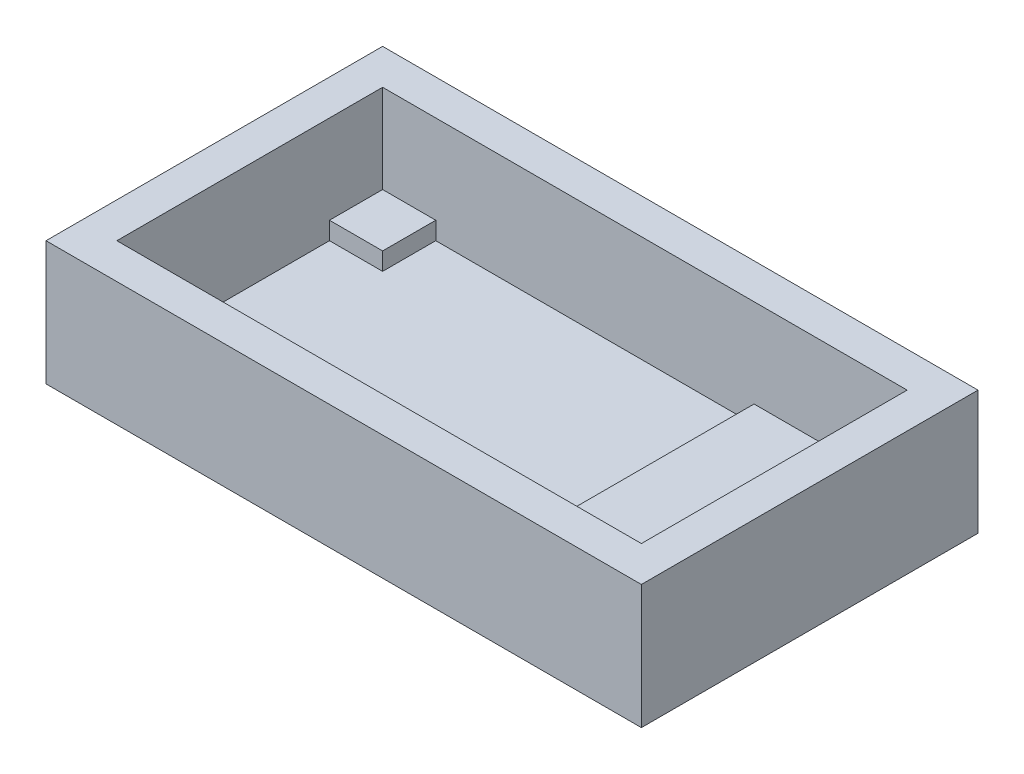
ISO-10303-21;
HEADER;
FILE_DESCRIPTION(('STEP AP214'),'2;1');
FILE_NAME('part.step','',(''),(''),'','','');
FILE_SCHEMA(('AUTOMOTIVE_DESIGN { 1 0 10303 214 1 1 1 1 }'));
ENDSEC;
DATA;
#1=APPLICATION_CONTEXT('core data for automotive mechanical design processes');
#2=APPLICATION_PROTOCOL_DEFINITION('international standard','automotive_design',2000,#1);
#3=PRODUCT_CONTEXT('',#1,'mechanical');
#4=PRODUCT('Part','Part','',(#3));
#5=PRODUCT_RELATED_PRODUCT_CATEGORY('part','',(#4));
#6=PRODUCT_DEFINITION_FORMATION('','',#4);
#7=PRODUCT_DEFINITION_CONTEXT('part definition',#1,'design');
#8=PRODUCT_DEFINITION('design','',#6,#7);
#9=PRODUCT_DEFINITION_SHAPE('','',#8);
#10=(LENGTH_UNIT() NAMED_UNIT(*) SI_UNIT(.MILLI.,.METRE.));
#11=(NAMED_UNIT(*) PLANE_ANGLE_UNIT() SI_UNIT($,.RADIAN.));
#12=(NAMED_UNIT(*) SI_UNIT($,.STERADIAN.) SOLID_ANGLE_UNIT());
#13=UNCERTAINTY_MEASURE_WITH_UNIT(LENGTH_MEASURE(1.E-05),#10,'distance_accuracy_value','');
#14=(GEOMETRIC_REPRESENTATION_CONTEXT(3) GLOBAL_UNCERTAINTY_ASSIGNED_CONTEXT((#13)) GLOBAL_UNIT_ASSIGNED_CONTEXT((#10,
#11,#12)) REPRESENTATION_CONTEXT('',''));
#15=CARTESIAN_POINT('',(0.,0.,0.));
#16=DIRECTION('',(0.,0.,1.));
#17=DIRECTION('',(1.,0.,0.));
#18=AXIS2_PLACEMENT_3D('',#15,#16,#17);
#19=CARTESIAN_POINT('',(0.,5.,0.));
#20=DIRECTION('',(0.,-1.,0.));
#21=DIRECTION('',(0.,0.,-1.));
#22=AXIS2_PLACEMENT_3D('',#19,#20,#21);
#23=PLANE('',#22);
#24=DIRECTION('',(0.,0.,1.));
#25=VECTOR('',#24,1.);
#26=CARTESIAN_POINT('',(114.837692593404,5.,-85.0103773584906));
#27=LINE('',#26,#25);
#28=CARTESIAN_POINT('',(114.837692593404,5.,-85.0103773584906));
#29=VERTEX_POINT('',#28);
#30=CARTESIAN_POINT('',(114.837692593404,5.,-10.));
#31=VERTEX_POINT('',#30);
#32=EDGE_CURVE('E183',#29,#31,#27,.T.);
#33=ORIENTED_EDGE('',*,*,#32,.F.);
#34=DIRECTION('',(-1.,0.,0.));
#35=VECTOR('',#34,1.);
#36=CARTESIAN_POINT('',(10.,5.,-85.0103773584906));
#37=LINE('',#36,#35);
#38=CARTESIAN_POINT('',(25.,5.,-85.0103773584906));
#39=VERTEX_POINT('',#38);
#40=EDGE_CURVE('E234',#29,#39,#37,.T.);
#41=ORIENTED_EDGE('',*,*,#40,.T.);
#42=DIRECTION('',(0.,0.,-1.));
#43=VECTOR('',#42,1.);
#44=CARTESIAN_POINT('',(25.,5.,-85.0103773584906));
#45=LINE('',#44,#43);
#46=CARTESIAN_POINT('',(25.,5.,-70.0103773584906));
#47=VERTEX_POINT('',#46);
#48=EDGE_CURVE('E209',#47,#39,#45,.T.);
#49=ORIENTED_EDGE('',*,*,#48,.F.);
#50=DIRECTION('',(1.,0.,0.));
#51=VECTOR('',#50,1.);
#52=CARTESIAN_POINT('',(10.,5.,-70.0103773584906));
#53=LINE('',#52,#51);
#54=CARTESIAN_POINT('',(10.,5.,-70.0103773584906));
#55=VERTEX_POINT('',#54);
#56=EDGE_CURVE('E198',#55,#47,#53,.T.);
#57=ORIENTED_EDGE('',*,*,#56,.F.);
#58=DIRECTION('',(0.,0.,1.));
#59=VECTOR('',#58,1.);
#60=CARTESIAN_POINT('',(10.,5.,-10.));
#61=LINE('',#60,#59);
#62=CARTESIAN_POINT('',(10.,5.,-25.));
#63=VERTEX_POINT('',#62);
#64=EDGE_CURVE('E230',#55,#63,#61,.T.);
#65=ORIENTED_EDGE('',*,*,#64,.T.);
#66=DIRECTION('',(-1.,0.,0.));
#67=VECTOR('',#66,1.);
#68=CARTESIAN_POINT('',(10.,5.,-25.));
#69=LINE('',#68,#67);
#70=CARTESIAN_POINT('',(25.,5.,-25.));
#71=VERTEX_POINT('',#70);
#72=EDGE_CURVE('E193',#71,#63,#69,.T.);
#73=ORIENTED_EDGE('',*,*,#72,.F.);
#74=DIRECTION('',(0.,0.,-1.));
#75=VECTOR('',#74,1.);
#76=CARTESIAN_POINT('',(25.,5.,-10.));
#77=LINE('',#76,#75);
#78=CARTESIAN_POINT('',(25.,5.,-10.));
#79=VERTEX_POINT('',#78);
#80=EDGE_CURVE('E195',#79,#71,#77,.T.);
#81=ORIENTED_EDGE('',*,*,#80,.F.);
#82=DIRECTION('',(1.,0.,0.));
#83=VECTOR('',#82,1.);
#84=CARTESIAN_POINT('',(10.,5.,-10.));
#85=LINE('',#84,#83);
#86=EDGE_CURVE('E241',#79,#31,#85,.T.);
#87=ORIENTED_EDGE('',*,*,#86,.T.);
#88=EDGE_LOOP('',(#33,#41,#49,#57,#65,#73,#81,#87));
#89=FACE_BOUND('',#88,.T.);
#90=ADVANCED_FACE('F41',(#89),#23,.F.);
#91=CARTESIAN_POINT('',(10.,35.,-10.));
#92=DIRECTION('',(0.,0.,-1.));
#93=DIRECTION('',(-1.,0.,0.));
#94=AXIS2_PLACEMENT_3D('',#91,#92,#93);
#95=PLANE('',#94);
#96=DIRECTION('',(1.,0.,0.));
#97=VECTOR('',#96,1.);
#98=CARTESIAN_POINT('',(114.837692593404,10.,-10.));
#99=LINE('',#98,#97);
#100=CARTESIAN_POINT('',(114.837692593404,10.,-10.));
#101=VERTEX_POINT('',#100);
#102=CARTESIAN_POINT('',(158.045783506068,10.,-10.));
#103=VERTEX_POINT('',#102);
#104=EDGE_CURVE('E56',#101,#103,#99,.T.);
#105=ORIENTED_EDGE('',*,*,#104,.F.);
#106=DIRECTION('',(0.,-1.,0.));
#107=VECTOR('',#106,1.);
#108=CARTESIAN_POINT('',(114.837692593404,10.,-10.));
#109=LINE('',#108,#107);
#110=EDGE_CURVE('E61',#101,#31,#109,.T.);
#111=ORIENTED_EDGE('',*,*,#110,.T.);
#112=ORIENTED_EDGE('',*,*,#86,.F.);
#113=DIRECTION('',(0.,-1.,0.));
#114=VECTOR('',#113,1.);
#115=CARTESIAN_POINT('',(25.,10.,-10.));
#116=LINE('',#115,#114);
#117=CARTESIAN_POINT('',(25.,10.,-10.));
#118=VERTEX_POINT('',#117);
#119=EDGE_CURVE('E184',#118,#79,#116,.T.);
#120=ORIENTED_EDGE('',*,*,#119,.F.);
#121=DIRECTION('',(1.,0.,0.));
#122=VECTOR('',#121,1.);
#123=CARTESIAN_POINT('',(10.,10.,-10.));
#124=LINE('',#123,#122);
#125=CARTESIAN_POINT('',(10.,10.,-10.));
#126=VERTEX_POINT('',#125);
#127=EDGE_CURVE('E202',#126,#118,#124,.T.);
#128=ORIENTED_EDGE('',*,*,#127,.F.);
#129=DIRECTION('',(0.,-1.,0.));
#130=VECTOR('',#129,1.);
#131=CARTESIAN_POINT('',(10.,35.,-10.));
#132=LINE('',#131,#130);
#133=CARTESIAN_POINT('',(10.,35.,-10.));
#134=VERTEX_POINT('',#133);
#135=EDGE_CURVE('E247',#134,#126,#132,.T.);
#136=ORIENTED_EDGE('',*,*,#135,.F.);
#137=DIRECTION('',(1.,0.,0.));
#138=VECTOR('',#137,1.);
#139=CARTESIAN_POINT('',(10.,35.,-10.));
#140=LINE('',#139,#138);
#141=CARTESIAN_POINT('',(158.045783506068,35.,-10.));
#142=VERTEX_POINT('',#141);
#143=EDGE_CURVE('E233',#134,#142,#140,.T.);
#144=ORIENTED_EDGE('',*,*,#143,.T.);
#145=DIRECTION('',(0.,-1.,0.));
#146=VECTOR('',#145,1.);
#147=CARTESIAN_POINT('',(158.045783506068,35.,-10.));
#148=LINE('',#147,#146);
#149=EDGE_CURVE('E164',#142,#103,#148,.T.);
#150=ORIENTED_EDGE('',*,*,#149,.T.);
#151=EDGE_LOOP('',(#105,#111,#112,#120,#128,#136,#144,#150));
#152=FACE_BOUND('',#151,.T.);
#153=ADVANCED_FACE('F304',(#152),#95,.T.);
#154=CARTESIAN_POINT('',(10.,35.,-85.0103773584906));
#155=DIRECTION('',(0.,0.,1.));
#156=DIRECTION('',(1.,0.,0.));
#157=AXIS2_PLACEMENT_3D('',#154,#155,#156);
#158=PLANE('',#157);
#159=ORIENTED_EDGE('',*,*,#40,.F.);
#160=DIRECTION('',(0.,-1.,0.));
#161=VECTOR('',#160,1.);
#162=CARTESIAN_POINT('',(114.837692593404,10.,-85.0103773584906));
#163=LINE('',#162,#161);
#164=CARTESIAN_POINT('',(114.837692593404,10.,-85.0103773584906));
#165=VERTEX_POINT('',#164);
#166=EDGE_CURVE('E172',#165,#29,#163,.T.);
#167=ORIENTED_EDGE('',*,*,#166,.F.);
#168=DIRECTION('',(-1.,0.,0.));
#169=VECTOR('',#168,1.);
#170=CARTESIAN_POINT('',(114.837692593404,10.,-85.0103773584906));
#171=LINE('',#170,#169);
#172=CARTESIAN_POINT('',(158.045783506068,10.,-85.0103773584906));
#173=VERTEX_POINT('',#172);
#174=EDGE_CURVE('E168',#173,#165,#171,.T.);
#175=ORIENTED_EDGE('',*,*,#174,.F.);
#176=DIRECTION('',(0.,-1.,0.));
#177=VECTOR('',#176,1.);
#178=CARTESIAN_POINT('',(158.045783506068,35.,-85.0103773584906));
#179=LINE('',#178,#177);
#180=CARTESIAN_POINT('',(158.045783506068,35.,-85.0103773584906));
#181=VERTEX_POINT('',#180);
#182=EDGE_CURVE('E154',#181,#173,#179,.T.);
#183=ORIENTED_EDGE('',*,*,#182,.F.);
#184=DIRECTION('',(-1.,0.,0.));
#185=VECTOR('',#184,1.);
#186=CARTESIAN_POINT('',(10.,35.,-85.0103773584906));
#187=LINE('',#186,#185);
#188=CARTESIAN_POINT('',(10.,35.,-85.0103773584906));
#189=VERTEX_POINT('',#188);
#190=EDGE_CURVE('E237',#181,#189,#187,.T.);
#191=ORIENTED_EDGE('',*,*,#190,.T.);
#192=DIRECTION('',(0.,-1.,0.));
#193=VECTOR('',#192,1.);
#194=CARTESIAN_POINT('',(10.,35.,-85.0103773584906));
#195=LINE('',#194,#193);
#196=CARTESIAN_POINT('',(10.,10.,-85.0103773584906));
#197=VERTEX_POINT('',#196);
#198=EDGE_CURVE('E165',#189,#197,#195,.T.);
#199=ORIENTED_EDGE('',*,*,#198,.T.);
#200=DIRECTION('',(-1.,0.,0.));
#201=VECTOR('',#200,1.);
#202=CARTESIAN_POINT('',(10.,10.,-85.0103773584906));
#203=LINE('',#202,#201);
#204=CARTESIAN_POINT('',(25.,10.,-85.0103773584906));
#205=VERTEX_POINT('',#204);
#206=EDGE_CURVE('E214',#205,#197,#203,.T.);
#207=ORIENTED_EDGE('',*,*,#206,.F.);
#208=DIRECTION('',(0.,-1.,0.));
#209=VECTOR('',#208,1.);
#210=CARTESIAN_POINT('',(25.,10.,-85.0103773584906));
#211=LINE('',#210,#209);
#212=EDGE_CURVE('E217',#205,#39,#211,.T.);
#213=ORIENTED_EDGE('',*,*,#212,.T.);
#214=EDGE_LOOP('',(#159,#167,#175,#183,#191,#199,#207,#213));
#215=FACE_BOUND('',#214,.T.);
#216=ADVANCED_FACE('F170',(#215),#158,.T.);
#217=CARTESIAN_POINT('',(10.,35.,-10.));
#218=DIRECTION('',(1.,0.,0.));
#219=DIRECTION('',(0.,0.,-1.));
#220=AXIS2_PLACEMENT_3D('',#217,#218,#219);
#221=PLANE('',#220);
#222=DIRECTION('',(0.,0.,1.));
#223=VECTOR('',#222,1.);
#224=CARTESIAN_POINT('',(10.,10.,-10.));
#225=LINE('',#224,#223);
#226=CARTESIAN_POINT('',(10.,10.,-25.));
#227=VERTEX_POINT('',#226);
#228=EDGE_CURVE('E196',#227,#126,#225,.T.);
#229=ORIENTED_EDGE('',*,*,#228,.F.);
#230=DIRECTION('',(0.,-1.,0.));
#231=VECTOR('',#230,1.);
#232=CARTESIAN_POINT('',(10.,10.,-25.));
#233=LINE('',#232,#231);
#234=EDGE_CURVE('E189',#227,#63,#233,.T.);
#235=ORIENTED_EDGE('',*,*,#234,.T.);
#236=ORIENTED_EDGE('',*,*,#64,.F.);
#237=DIRECTION('',(0.,-1.,0.));
#238=VECTOR('',#237,1.);
#239=CARTESIAN_POINT('',(10.,10.,-70.0103773584906));
#240=LINE('',#239,#238);
#241=CARTESIAN_POINT('',(10.,10.,-70.0103773584906));
#242=VERTEX_POINT('',#241);
#243=EDGE_CURVE('E227',#242,#55,#240,.T.);
#244=ORIENTED_EDGE('',*,*,#243,.F.);
#245=DIRECTION('',(0.,0.,1.));
#246=VECTOR('',#245,1.);
#247=CARTESIAN_POINT('',(10.,10.,-85.0103773584906));
#248=LINE('',#247,#246);
#249=EDGE_CURVE('E205',#197,#242,#248,.T.);
#250=ORIENTED_EDGE('',*,*,#249,.F.);
#251=ORIENTED_EDGE('',*,*,#198,.F.);
#252=DIRECTION('',(0.,0.,1.));
#253=VECTOR('',#252,1.);
#254=CARTESIAN_POINT('',(10.,35.,-10.));
#255=LINE('',#254,#253);
#256=EDGE_CURVE('E231',#189,#134,#255,.T.);
#257=ORIENTED_EDGE('',*,*,#256,.T.);
#258=ORIENTED_EDGE('',*,*,#135,.T.);
#259=EDGE_LOOP('',(#229,#235,#236,#244,#250,#251,#257,#258));
#260=FACE_BOUND('',#259,.T.);
#261=ADVANCED_FACE('F302',(#260),#221,.T.);
#262=CARTESIAN_POINT('',(0.,5.,0.));
#263=DIRECTION('',(1.,0.,0.));
#264=DIRECTION('',(0.,0.,-1.));
#265=AXIS2_PLACEMENT_3D('',#262,#263,#264);
#266=PLANE('',#265);
#267=DIRECTION('',(0.,0.,1.));
#268=VECTOR('',#267,1.);
#269=CARTESIAN_POINT('',(0.,0.,0.));
#270=LINE('',#269,#268);
#271=CARTESIAN_POINT('',(0.,0.,-95.0103773584906));
#272=VERTEX_POINT('',#271);
#273=CARTESIAN_POINT('',(0.,0.,0.));
#274=VERTEX_POINT('',#273);
#275=EDGE_CURVE('E262',#272,#274,#270,.T.);
#276=ORIENTED_EDGE('',*,*,#275,.T.);
#277=DIRECTION('',(0.,-1.,0.));
#278=VECTOR('',#277,1.);
#279=CARTESIAN_POINT('',(0.,5.,0.));
#280=LINE('',#279,#278);
#281=CARTESIAN_POINT('',(0.,35.,0.));
#282=VERTEX_POINT('',#281);
#283=EDGE_CURVE('E11',#282,#274,#280,.T.);
#284=ORIENTED_EDGE('',*,*,#283,.F.);
#285=DIRECTION('',(0.,0.,1.));
#286=VECTOR('',#285,1.);
#287=CARTESIAN_POINT('',(0.,35.,-95.0103773584906));
#288=LINE('',#287,#286);
#289=CARTESIAN_POINT('',(0.,35.,-95.0103773584906));
#290=VERTEX_POINT('',#289);
#291=EDGE_CURVE('E253',#290,#282,#288,.T.);
#292=ORIENTED_EDGE('',*,*,#291,.F.);
#293=DIRECTION('',(0.,-1.,0.));
#294=VECTOR('',#293,1.);
#295=CARTESIAN_POINT('',(0.,5.,-95.0103773584906));
#296=LINE('',#295,#294);
#297=EDGE_CURVE('E271',#290,#272,#296,.T.);
#298=ORIENTED_EDGE('',*,*,#297,.T.);
#299=EDGE_LOOP('',(#276,#284,#292,#298));
#300=FACE_BOUND('',#299,.T.);
#301=ADVANCED_FACE('F43',(#300),#266,.F.);
#302=CARTESIAN_POINT('',(0.,5.,0.));
#303=DIRECTION('',(0.,0.,-1.));
#304=DIRECTION('',(-1.,0.,0.));
#305=AXIS2_PLACEMENT_3D('',#302,#303,#304);
#306=PLANE('',#305);
#307=DIRECTION('',(1.,0.,0.));
#308=VECTOR('',#307,1.);
#309=CARTESIAN_POINT('',(0.,0.,0.));
#310=LINE('',#309,#308);
#311=CARTESIAN_POINT('',(168.045783506068,0.,0.));
#312=VERTEX_POINT('',#311);
#313=EDGE_CURVE('E265',#274,#312,#310,.T.);
#314=ORIENTED_EDGE('',*,*,#313,.T.);
#315=DIRECTION('',(0.,-1.,0.));
#316=VECTOR('',#315,1.);
#317=CARTESIAN_POINT('',(168.045783506068,5.,0.));
#318=LINE('',#317,#316);
#319=CARTESIAN_POINT('',(168.045783506068,35.,0.));
#320=VERTEX_POINT('',#319);
#321=EDGE_CURVE('E49',#320,#312,#318,.T.);
#322=ORIENTED_EDGE('',*,*,#321,.F.);
#323=DIRECTION('',(1.,0.,0.));
#324=VECTOR('',#323,1.);
#325=CARTESIAN_POINT('',(0.,35.,0.));
#326=LINE('',#325,#324);
#327=EDGE_CURVE('E256',#282,#320,#326,.T.);
#328=ORIENTED_EDGE('',*,*,#327,.F.);
#329=ORIENTED_EDGE('',*,*,#283,.T.);
#330=EDGE_LOOP('',(#314,#322,#328,#329));
#331=FACE_BOUND('',#330,.T.);
#332=ADVANCED_FACE('F295',(#331),#306,.F.);
#333=CARTESIAN_POINT('',(168.045783506068,5.,0.));
#334=DIRECTION('',(-1.,0.,0.));
#335=DIRECTION('',(0.,0.,1.));
#336=AXIS2_PLACEMENT_3D('',#333,#334,#335);
#337=PLANE('',#336);
#338=DIRECTION('',(0.,0.,-1.));
#339=VECTOR('',#338,1.);
#340=CARTESIAN_POINT('',(168.045783506068,0.,0.));
#341=LINE('',#340,#339);
#342=CARTESIAN_POINT('',(168.045783506068,0.,-95.0103773584906));
#343=VERTEX_POINT('',#342);
#344=EDGE_CURVE('E267',#312,#343,#341,.T.);
#345=ORIENTED_EDGE('',*,*,#344,.T.);
#346=DIRECTION('',(0.,-1.,0.));
#347=VECTOR('',#346,1.);
#348=CARTESIAN_POINT('',(168.045783506068,5.,-95.0103773584906));
#349=LINE('',#348,#347);
#350=CARTESIAN_POINT('',(168.045783506068,35.,-95.0103773584906));
#351=VERTEX_POINT('',#350);
#352=EDGE_CURVE('E274',#351,#343,#349,.T.);
#353=ORIENTED_EDGE('',*,*,#352,.F.);
#354=DIRECTION('',(0.,0.,-1.));
#355=VECTOR('',#354,1.);
#356=CARTESIAN_POINT('',(168.045783506068,35.,0.));
#357=LINE('',#356,#355);
#358=EDGE_CURVE('E259',#320,#351,#357,.T.);
#359=ORIENTED_EDGE('',*,*,#358,.F.);
#360=ORIENTED_EDGE('',*,*,#321,.T.);
#361=EDGE_LOOP('',(#345,#353,#359,#360));
#362=FACE_BOUND('',#361,.T.);
#363=ADVANCED_FACE('F280',(#362),#337,.F.);
#364=CARTESIAN_POINT('',(0.,5.,-95.0103773584906));
#365=DIRECTION('',(0.,0.,1.));
#366=DIRECTION('',(1.,0.,0.));
#367=AXIS2_PLACEMENT_3D('',#364,#365,#366);
#368=PLANE('',#367);
#369=DIRECTION('',(-1.,0.,0.));
#370=VECTOR('',#369,1.);
#371=CARTESIAN_POINT('',(0.,0.,-95.0103773584906));
#372=LINE('',#371,#370);
#373=EDGE_CURVE('E269',#343,#272,#372,.T.);
#374=ORIENTED_EDGE('',*,*,#373,.T.);
#375=ORIENTED_EDGE('',*,*,#297,.F.);
#376=DIRECTION('',(-1.,0.,0.));
#377=VECTOR('',#376,1.);
#378=CARTESIAN_POINT('',(168.045783506068,35.,-95.0103773584906));
#379=LINE('',#378,#377);
#380=EDGE_CURVE('E250',#351,#290,#379,.T.);
#381=ORIENTED_EDGE('',*,*,#380,.F.);
#382=ORIENTED_EDGE('',*,*,#352,.T.);
#383=EDGE_LOOP('',(#374,#375,#381,#382));
#384=FACE_BOUND('',#383,.T.);
#385=ADVANCED_FACE('F288',(#384),#368,.F.);
#386=CARTESIAN_POINT('',(0.,0.,0.));
#387=DIRECTION('',(0.,-1.,0.));
#388=DIRECTION('',(0.,0.,-1.));
#389=AXIS2_PLACEMENT_3D('',#386,#387,#388);
#390=PLANE('',#389);
#391=ORIENTED_EDGE('',*,*,#275,.F.);
#392=ORIENTED_EDGE('',*,*,#373,.F.);
#393=ORIENTED_EDGE('',*,*,#344,.F.);
#394=ORIENTED_EDGE('',*,*,#313,.F.);
#395=EDGE_LOOP('',(#391,#392,#393,#394));
#396=FACE_BOUND('',#395,.T.);
#397=ADVANCED_FACE('F286',(#396),#390,.T.);
#398=CARTESIAN_POINT('',(0.,35.,0.));
#399=DIRECTION('',(0.,1.,0.));
#400=DIRECTION('',(0.,0.,1.));
#401=AXIS2_PLACEMENT_3D('',#398,#399,#400);
#402=PLANE('',#401);
#403=ORIENTED_EDGE('',*,*,#380,.T.);
#404=ORIENTED_EDGE('',*,*,#291,.T.);
#405=ORIENTED_EDGE('',*,*,#327,.T.);
#406=ORIENTED_EDGE('',*,*,#358,.T.);
#407=EDGE_LOOP('',(#403,#404,#405,#406));
#408=FACE_BOUND('',#407,.T.);
#409=ORIENTED_EDGE('',*,*,#143,.F.);
#410=ORIENTED_EDGE('',*,*,#256,.F.);
#411=ORIENTED_EDGE('',*,*,#190,.F.);
#412=DIRECTION('',(0.,0.,-1.));
#413=VECTOR('',#412,1.);
#414=CARTESIAN_POINT('',(158.045783506068,35.,-10.));
#415=LINE('',#414,#413);
#416=EDGE_CURVE('E161',#142,#181,#415,.T.);
#417=ORIENTED_EDGE('',*,*,#416,.F.);
#418=EDGE_LOOP('',(#409,#410,#411,#417));
#419=FACE_BOUND('',#418,.T.);
#420=ADVANCED_FACE('F293',(#408,#419),#402,.T.);
#421=CARTESIAN_POINT('',(158.045783506068,35.,-10.));
#422=DIRECTION('',(-1.,0.,0.));
#423=DIRECTION('',(0.,0.,1.));
#424=AXIS2_PLACEMENT_3D('',#421,#422,#423);
#425=PLANE('',#424);
#426=DIRECTION('',(0.,0.,-1.));
#427=VECTOR('',#426,1.);
#428=CARTESIAN_POINT('',(158.045783506068,10.,-10.));
#429=LINE('',#428,#427);
#430=EDGE_CURVE('E159',#103,#173,#429,.T.);
#431=ORIENTED_EDGE('',*,*,#430,.F.);
#432=ORIENTED_EDGE('',*,*,#149,.F.);
#433=ORIENTED_EDGE('',*,*,#416,.T.);
#434=ORIENTED_EDGE('',*,*,#182,.T.);
#435=EDGE_LOOP('',(#431,#432,#433,#434));
#436=FACE_BOUND('',#435,.T.);
#437=ADVANCED_FACE('F156',(#436),#425,.T.);
#438=CARTESIAN_POINT('',(10.,10.,-70.0103773584906));
#439=DIRECTION('',(0.,0.,-1.));
#440=DIRECTION('',(-1.,0.,0.));
#441=AXIS2_PLACEMENT_3D('',#438,#439,#440);
#442=PLANE('',#441);
#443=ORIENTED_EDGE('',*,*,#56,.T.);
#444=DIRECTION('',(0.,-1.,0.));
#445=VECTOR('',#444,1.);
#446=CARTESIAN_POINT('',(25.,10.,-70.0103773584906));
#447=LINE('',#446,#445);
#448=CARTESIAN_POINT('',(25.,10.,-70.0103773584906));
#449=VERTEX_POINT('',#448);
#450=EDGE_CURVE('E224',#449,#47,#447,.T.);
#451=ORIENTED_EDGE('',*,*,#450,.F.);
#452=DIRECTION('',(1.,0.,0.));
#453=VECTOR('',#452,1.);
#454=CARTESIAN_POINT('',(10.,10.,-70.0103773584906));
#455=LINE('',#454,#453);
#456=EDGE_CURVE('E208',#242,#449,#455,.T.);
#457=ORIENTED_EDGE('',*,*,#456,.F.);
#458=ORIENTED_EDGE('',*,*,#243,.T.);
#459=EDGE_LOOP('',(#443,#451,#457,#458));
#460=FACE_BOUND('',#459,.T.);
#461=ADVANCED_FACE('F338',(#460),#442,.F.);
#462=CARTESIAN_POINT('',(25.,10.,-85.0103773584906));
#463=DIRECTION('',(-1.,0.,0.));
#464=DIRECTION('',(0.,0.,1.));
#465=AXIS2_PLACEMENT_3D('',#462,#463,#464);
#466=PLANE('',#465);
#467=ORIENTED_EDGE('',*,*,#48,.T.);
#468=ORIENTED_EDGE('',*,*,#212,.F.);
#469=DIRECTION('',(0.,0.,-1.));
#470=VECTOR('',#469,1.);
#471=CARTESIAN_POINT('',(25.,10.,-85.0103773584906));
#472=LINE('',#471,#470);
#473=EDGE_CURVE('E211',#449,#205,#472,.T.);
#474=ORIENTED_EDGE('',*,*,#473,.F.);
#475=ORIENTED_EDGE('',*,*,#450,.T.);
#476=EDGE_LOOP('',(#467,#468,#474,#475));
#477=FACE_BOUND('',#476,.T.);
#478=ADVANCED_FACE('F373',(#477),#466,.F.);
#479=CARTESIAN_POINT('',(0.,10.,0.));
#480=DIRECTION('',(0.,1.,0.));
#481=DIRECTION('',(0.,0.,1.));
#482=AXIS2_PLACEMENT_3D('',#479,#480,#481);
#483=PLANE('',#482);
#484=ORIENTED_EDGE('',*,*,#249,.T.);
#485=ORIENTED_EDGE('',*,*,#456,.T.);
#486=ORIENTED_EDGE('',*,*,#473,.T.);
#487=ORIENTED_EDGE('',*,*,#206,.T.);
#488=EDGE_LOOP('',(#484,#485,#486,#487));
#489=FACE_BOUND('',#488,.T.);
#490=ADVANCED_FACE('F383',(#489),#483,.T.);
#491=CARTESIAN_POINT('',(25.,10.,-10.));
#492=DIRECTION('',(-1.,0.,0.));
#493=DIRECTION('',(0.,0.,1.));
#494=AXIS2_PLACEMENT_3D('',#491,#492,#493);
#495=PLANE('',#494);
#496=ORIENTED_EDGE('',*,*,#80,.T.);
#497=DIRECTION('',(0.,-1.,0.));
#498=VECTOR('',#497,1.);
#499=CARTESIAN_POINT('',(25.,10.,-25.));
#500=LINE('',#499,#498);
#501=CARTESIAN_POINT('',(25.,10.,-25.));
#502=VERTEX_POINT('',#501);
#503=EDGE_CURVE('E186',#502,#71,#500,.T.);
#504=ORIENTED_EDGE('',*,*,#503,.F.);
#505=DIRECTION('',(0.,0.,-1.));
#506=VECTOR('',#505,1.);
#507=CARTESIAN_POINT('',(25.,10.,-10.));
#508=LINE('',#507,#506);
#509=EDGE_CURVE('E200',#118,#502,#508,.T.);
#510=ORIENTED_EDGE('',*,*,#509,.F.);
#511=ORIENTED_EDGE('',*,*,#119,.T.);
#512=EDGE_LOOP('',(#496,#504,#510,#511));
#513=FACE_BOUND('',#512,.T.);
#514=ADVANCED_FACE('F393',(#513),#495,.F.);
#515=CARTESIAN_POINT('',(10.,10.,-25.));
#516=DIRECTION('',(0.,0.,1.));
#517=DIRECTION('',(1.,0.,0.));
#518=AXIS2_PLACEMENT_3D('',#515,#516,#517);
#519=PLANE('',#518);
#520=ORIENTED_EDGE('',*,*,#72,.T.);
#521=ORIENTED_EDGE('',*,*,#234,.F.);
#522=DIRECTION('',(-1.,0.,0.));
#523=VECTOR('',#522,1.);
#524=CARTESIAN_POINT('',(10.,10.,-25.));
#525=LINE('',#524,#523);
#526=EDGE_CURVE('E192',#502,#227,#525,.T.);
#527=ORIENTED_EDGE('',*,*,#526,.F.);
#528=ORIENTED_EDGE('',*,*,#503,.T.);
#529=EDGE_LOOP('',(#520,#521,#527,#528));
#530=FACE_BOUND('',#529,.T.);
#531=ADVANCED_FACE('F403',(#530),#519,.F.);
#532=CARTESIAN_POINT('',(0.,10.,0.));
#533=DIRECTION('',(0.,-1.,0.));
#534=DIRECTION('',(0.,0.,-1.));
#535=AXIS2_PLACEMENT_3D('',#532,#533,#534);
#536=PLANE('',#535);
#537=ORIENTED_EDGE('',*,*,#228,.T.);
#538=ORIENTED_EDGE('',*,*,#127,.T.);
#539=ORIENTED_EDGE('',*,*,#509,.T.);
#540=ORIENTED_EDGE('',*,*,#526,.T.);
#541=EDGE_LOOP('',(#537,#538,#539,#540));
#542=FACE_BOUND('',#541,.T.);
#543=ADVANCED_FACE('F413',(#542),#536,.F.);
#544=CARTESIAN_POINT('',(114.837692593404,10.,-85.0103773584906));
#545=DIRECTION('',(1.,0.,0.));
#546=DIRECTION('',(0.,0.,-1.));
#547=AXIS2_PLACEMENT_3D('',#544,#545,#546);
#548=PLANE('',#547);
#549=ORIENTED_EDGE('',*,*,#32,.T.);
#550=ORIENTED_EDGE('',*,*,#110,.F.);
#551=DIRECTION('',(0.,0.,1.));
#552=VECTOR('',#551,1.);
#553=CARTESIAN_POINT('',(114.837692593404,10.,-85.0103773584906));
#554=LINE('',#553,#552);
#555=EDGE_CURVE('E178',#165,#101,#554,.T.);
#556=ORIENTED_EDGE('',*,*,#555,.F.);
#557=ORIENTED_EDGE('',*,*,#166,.T.);
#558=EDGE_LOOP('',(#549,#550,#556,#557));
#559=FACE_BOUND('',#558,.T.);
#560=ADVANCED_FACE('F423',(#559),#548,.F.);
#561=CARTESIAN_POINT('',(0.,10.,0.));
#562=DIRECTION('',(0.,1.,0.));
#563=DIRECTION('',(0.,0.,1.));
#564=AXIS2_PLACEMENT_3D('',#561,#562,#563);
#565=PLANE('',#564);
#566=ORIENTED_EDGE('',*,*,#555,.T.);
#567=ORIENTED_EDGE('',*,*,#104,.T.);
#568=ORIENTED_EDGE('',*,*,#430,.T.);
#569=ORIENTED_EDGE('',*,*,#174,.T.);
#570=EDGE_LOOP('',(#566,#567,#568,#569));
#571=FACE_BOUND('',#570,.T.);
#572=ADVANCED_FACE('F176',(#571),#565,.T.);
#573=CLOSED_SHELL('',(#90,#153,#216,#261,#301,#332,#363,#385,#397,#420,#437,#461,#478,#490,#514,
#531,#543,#560,#572));
#574=MANIFOLD_SOLID_BREP('B2',#573);
#575=ADVANCED_BREP_SHAPE_REPRESENTATION('',(#18,#574),#14);
#576=SHAPE_DEFINITION_REPRESENTATION(#9,#575);
ENDSEC;
END-ISO-10303-21;
